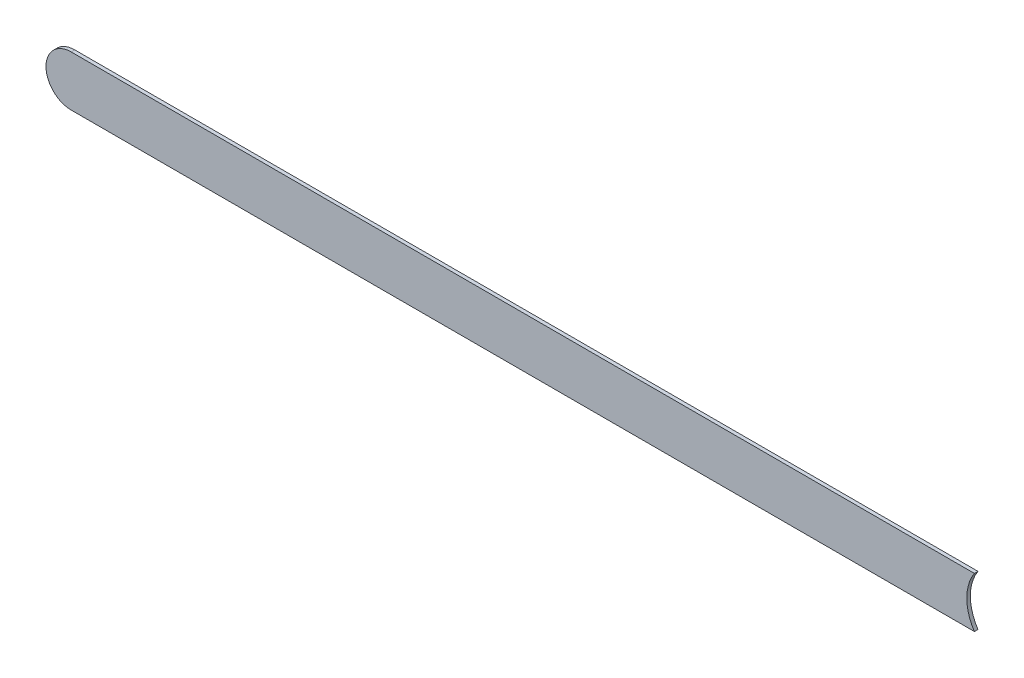
ISO-10303-21;
HEADER;
FILE_DESCRIPTION(('STEP AP214'),'2;1');
FILE_NAME('part.step','',(''),(''),'','','');
FILE_SCHEMA(('AUTOMOTIVE_DESIGN { 1 0 10303 214 1 1 1 1 }'));
ENDSEC;
DATA;
#1=APPLICATION_CONTEXT('core data for automotive mechanical design processes');
#2=APPLICATION_PROTOCOL_DEFINITION('international standard','automotive_design',2000,#1);
#3=PRODUCT_CONTEXT('',#1,'mechanical');
#4=PRODUCT('Part','Part','',(#3));
#5=PRODUCT_RELATED_PRODUCT_CATEGORY('part','',(#4));
#6=PRODUCT_DEFINITION_FORMATION('','',#4);
#7=PRODUCT_DEFINITION_CONTEXT('part definition',#1,'design');
#8=PRODUCT_DEFINITION('design','',#6,#7);
#9=PRODUCT_DEFINITION_SHAPE('','',#8);
#10=(LENGTH_UNIT() NAMED_UNIT(*) SI_UNIT(.MILLI.,.METRE.));
#11=(NAMED_UNIT(*) PLANE_ANGLE_UNIT() SI_UNIT($,.RADIAN.));
#12=(NAMED_UNIT(*) SI_UNIT($,.STERADIAN.) SOLID_ANGLE_UNIT());
#13=UNCERTAINTY_MEASURE_WITH_UNIT(LENGTH_MEASURE(1.E-05),#10,'distance_accuracy_value','');
#14=(GEOMETRIC_REPRESENTATION_CONTEXT(3) GLOBAL_UNCERTAINTY_ASSIGNED_CONTEXT((#13)) GLOBAL_UNIT_ASSIGNED_CONTEXT((#10,
#11,#12)) REPRESENTATION_CONTEXT('',''));
#15=CARTESIAN_POINT('',(0.,0.,0.));
#16=DIRECTION('',(0.,0.,1.));
#17=DIRECTION('',(1.,0.,0.));
#18=AXIS2_PLACEMENT_3D('',#15,#16,#17);
#19=CARTESIAN_POINT('',(38.76801238,106.6180113,0.));
#20=DIRECTION('',(0.,1.,0.));
#21=DIRECTION('',(1.,0.,0.));
#22=AXIS2_PLACEMENT_3D('',#19,#20,#21);
#23=PLANE('',#22);
#24=DIRECTION('',(1.,0.,0.));
#25=VECTOR('',#24,1.);
#26=CARTESIAN_POINT('',(38.76801238,106.6180113,0.03556));
#27=LINE('',#26,#25);
#28=CARTESIAN_POINT('',(38.76801238,106.6180113,0.03556));
#29=VERTEX_POINT('',#28);
#30=CARTESIAN_POINT('',(47.7368386096541,106.6180113,0.03556));
#31=VERTEX_POINT('',#30);
#32=EDGE_CURVE('E11',#29,#31,#27,.T.);
#33=ORIENTED_EDGE('',*,*,#32,.F.);
#34=DIRECTION('',(0.,0.,1.));
#35=VECTOR('',#34,1.);
#36=CARTESIAN_POINT('',(38.76801238,106.6180113,0.));
#37=LINE('',#36,#35);
#38=CARTESIAN_POINT('',(38.76801238,106.6180113,0.));
#39=VERTEX_POINT('',#38);
#40=EDGE_CURVE('E24',#39,#29,#37,.T.);
#41=ORIENTED_EDGE('',*,*,#40,.F.);
#42=DIRECTION('',(1.,0.,0.));
#43=VECTOR('',#42,1.);
#44=CARTESIAN_POINT('',(38.76801238,106.6180113,0.));
#45=LINE('',#44,#43);
#46=CARTESIAN_POINT('',(47.7368386096541,106.6180113,0.));
#47=VERTEX_POINT('',#46);
#48=EDGE_CURVE('E75',#39,#47,#45,.T.);
#49=ORIENTED_EDGE('',*,*,#48,.T.);
#50=DIRECTION('',(0.,0.,1.));
#51=VECTOR('',#50,1.);
#52=CARTESIAN_POINT('',(47.7368386096541,106.6180113,0.));
#53=LINE('',#52,#51);
#54=EDGE_CURVE('E37',#47,#31,#53,.T.);
#55=ORIENTED_EDGE('',*,*,#54,.T.);
#56=EDGE_LOOP('',(#33,#41,#49,#55));
#57=FACE_BOUND('',#56,.T.);
#58=ADVANCED_FACE('F17',(#57),#23,.F.);
#59=CARTESIAN_POINT('',(48.1110036,106.8680108,0.));
#60=DIRECTION('',(0.,0.,-1.));
#61=DIRECTION('',(1.,0.,0.));
#62=AXIS2_PLACEMENT_3D('',#59,#60,#61);
#63=CYLINDRICAL_SURFACE('',#62,0.4499991);
#64=DIRECTION('',(0.,0.,1.));
#65=VECTOR('',#64,1.);
#66=CARTESIAN_POINT('',(47.7368386096541,107.1180103,0.));
#67=LINE('',#66,#65);
#68=CARTESIAN_POINT('',(47.7368386096541,107.1180103,0.));
#69=VERTEX_POINT('',#68);
#70=CARTESIAN_POINT('',(47.7368386096541,107.1180103,0.03556));
#71=VERTEX_POINT('',#70);
#72=EDGE_CURVE('E67',#69,#71,#67,.T.);
#73=ORIENTED_EDGE('',*,*,#72,.T.);
#74=CARTESIAN_POINT('',(48.1110036,106.8680108,0.03556));
#75=DIRECTION('',(0.,0.,1.));
#76=DIRECTION('',(1.,0.,0.));
#77=AXIS2_PLACEMENT_3D('',#74,#75,#76);
#78=CIRCLE('',#77,0.4499991);
#79=EDGE_CURVE('E82',#71,#31,#78,.T.);
#80=ORIENTED_EDGE('',*,*,#79,.T.);
#81=ORIENTED_EDGE('',*,*,#54,.F.);
#82=CARTESIAN_POINT('',(48.1110036,106.8680108,0.));
#83=DIRECTION('',(0.,0.,1.));
#84=DIRECTION('',(1.,0.,0.));
#85=AXIS2_PLACEMENT_3D('',#82,#83,#84);
#86=CIRCLE('',#85,0.4499991);
#87=EDGE_CURVE('E80',#69,#47,#86,.T.);
#88=ORIENTED_EDGE('',*,*,#87,.F.);
#89=EDGE_LOOP('',(#73,#80,#81,#88));
#90=FACE_BOUND('',#89,.T.);
#91=ADVANCED_FACE('F88',(#90),#63,.F.);
#92=CARTESIAN_POINT('',(47.7368386096541,107.1180103,0.));
#93=DIRECTION('',(0.,-1.,0.));
#94=DIRECTION('',(-1.,0.,0.));
#95=AXIS2_PLACEMENT_3D('',#92,#93,#94);
#96=PLANE('',#95);
#97=DIRECTION('',(-1.,0.,0.));
#98=VECTOR('',#97,1.);
#99=CARTESIAN_POINT('',(48.1110036,107.1180103,0.03556));
#100=LINE('',#99,#98);
#101=CARTESIAN_POINT('',(38.76801238,107.1180103,0.03556));
#102=VERTEX_POINT('',#101);
#103=EDGE_CURVE('E71',#71,#102,#100,.T.);
#104=ORIENTED_EDGE('',*,*,#103,.F.);
#105=ORIENTED_EDGE('',*,*,#72,.F.);
#106=DIRECTION('',(-1.,0.,0.));
#107=VECTOR('',#106,1.);
#108=CARTESIAN_POINT('',(48.1110036,107.1180103,0.));
#109=LINE('',#108,#107);
#110=CARTESIAN_POINT('',(38.76801238,107.1180103,0.));
#111=VERTEX_POINT('',#110);
#112=EDGE_CURVE('E63',#69,#111,#109,.T.);
#113=ORIENTED_EDGE('',*,*,#112,.T.);
#114=DIRECTION('',(0.,0.,1.));
#115=VECTOR('',#114,1.);
#116=CARTESIAN_POINT('',(38.76801238,107.1180103,0.));
#117=LINE('',#116,#115);
#118=EDGE_CURVE('E53',#111,#102,#117,.T.);
#119=ORIENTED_EDGE('',*,*,#118,.T.);
#120=EDGE_LOOP('',(#104,#105,#113,#119));
#121=FACE_BOUND('',#120,.T.);
#122=ADVANCED_FACE('F66',(#121),#96,.F.);
#123=CARTESIAN_POINT('',(38.76801238,106.8680108,0.));
#124=DIRECTION('',(0.,0.,-1.));
#125=DIRECTION('',(0.,1.,0.));
#126=AXIS2_PLACEMENT_3D('',#123,#124,#125);
#127=CYLINDRICAL_SURFACE('',#126,0.249999500000001);
#128=CARTESIAN_POINT('',(38.76801238,106.8680108,0.03556));
#129=DIRECTION('',(0.,0.,1.));
#130=DIRECTION('',(0.,1.,0.));
#131=AXIS2_PLACEMENT_3D('',#128,#129,#130);
#132=CIRCLE('',#131,0.249999500000001);
#133=EDGE_CURVE('E59',#102,#29,#132,.T.);
#134=ORIENTED_EDGE('',*,*,#133,.F.);
#135=ORIENTED_EDGE('',*,*,#118,.F.);
#136=CARTESIAN_POINT('',(38.76801238,106.8680108,0.));
#137=DIRECTION('',(0.,0.,1.));
#138=DIRECTION('',(0.,1.,0.));
#139=AXIS2_PLACEMENT_3D('',#136,#137,#138);
#140=CIRCLE('',#139,0.249999500000001);
#141=EDGE_CURVE('E57',#111,#39,#140,.T.);
#142=ORIENTED_EDGE('',*,*,#141,.T.);
#143=ORIENTED_EDGE('',*,*,#40,.T.);
#144=EDGE_LOOP('',(#134,#135,#142,#143));
#145=FACE_BOUND('',#144,.T.);
#146=ADVANCED_FACE('F55',(#145),#127,.T.);
#147=CARTESIAN_POINT('',(38.76801238,106.6180113,0.));
#148=DIRECTION('',(0.,0.,-1.));
#149=DIRECTION('',(-1.,0.,0.));
#150=AXIS2_PLACEMENT_3D('',#147,#148,#149);
#151=PLANE('',#150);
#152=ORIENTED_EDGE('',*,*,#48,.F.);
#153=ORIENTED_EDGE('',*,*,#141,.F.);
#154=ORIENTED_EDGE('',*,*,#112,.F.);
#155=ORIENTED_EDGE('',*,*,#87,.T.);
#156=EDGE_LOOP('',(#152,#153,#154,#155));
#157=FACE_BOUND('',#156,.T.);
#158=ADVANCED_FACE('F74',(#157),#151,.T.);
#159=CARTESIAN_POINT('',(38.76801238,106.6180113,0.03556));
#160=DIRECTION('',(0.,0.,-1.));
#161=DIRECTION('',(-1.,0.,0.));
#162=AXIS2_PLACEMENT_3D('',#159,#160,#161);
#163=PLANE('',#162);
#164=ORIENTED_EDGE('',*,*,#133,.T.);
#165=ORIENTED_EDGE('',*,*,#32,.T.);
#166=ORIENTED_EDGE('',*,*,#79,.F.);
#167=ORIENTED_EDGE('',*,*,#103,.T.);
#168=EDGE_LOOP('',(#164,#165,#166,#167));
#169=FACE_BOUND('',#168,.T.);
#170=ADVANCED_FACE('F91',(#169),#163,.F.);
#171=CLOSED_SHELL('',(#58,#91,#122,#146,#158,#170));
#172=MANIFOLD_SOLID_BREP('B1',#171);
#173=ADVANCED_BREP_SHAPE_REPRESENTATION('',(#18,#172),#14);
#174=SHAPE_DEFINITION_REPRESENTATION(#9,#173);
ENDSEC;
END-ISO-10303-21;
